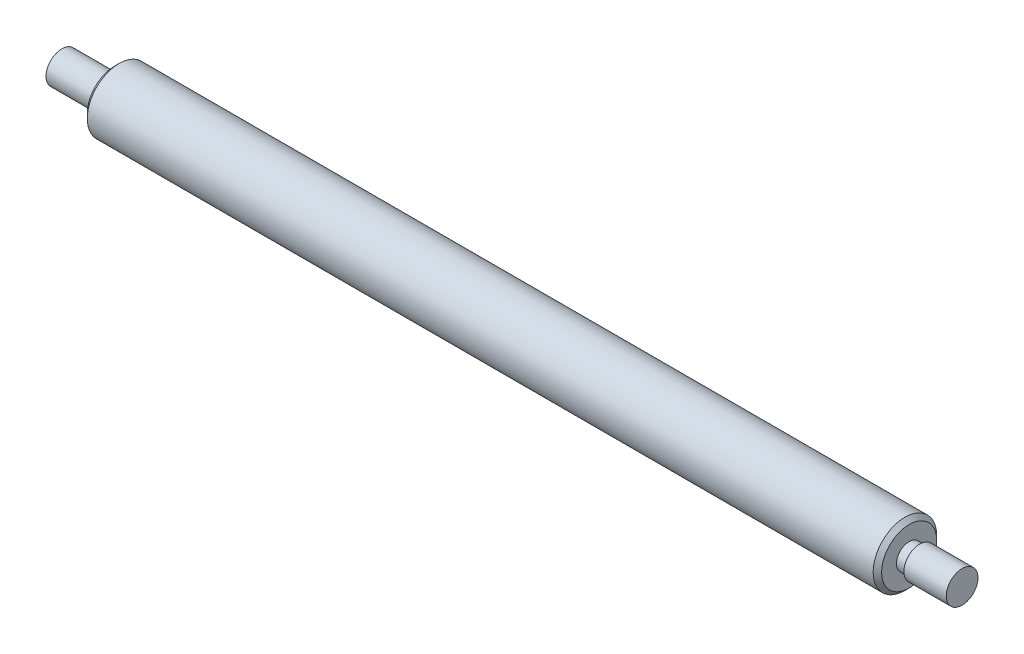
ISO-10303-21;
HEADER;
FILE_DESCRIPTION(('STEP AP214'),'2;1');
FILE_NAME('part.step','',(''),(''),'','','');
FILE_SCHEMA(('AUTOMOTIVE_DESIGN { 1 0 10303 214 1 1 1 1 }'));
ENDSEC;
DATA;
#1=APPLICATION_CONTEXT('core data for automotive mechanical design processes');
#2=APPLICATION_PROTOCOL_DEFINITION('international standard','automotive_design',2000,#1);
#3=PRODUCT_CONTEXT('',#1,'mechanical');
#4=PRODUCT('Part','Part','',(#3));
#5=PRODUCT_RELATED_PRODUCT_CATEGORY('part','',(#4));
#6=PRODUCT_DEFINITION_FORMATION('','',#4);
#7=PRODUCT_DEFINITION_CONTEXT('part definition',#1,'design');
#8=PRODUCT_DEFINITION('design','',#6,#7);
#9=PRODUCT_DEFINITION_SHAPE('','',#8);
#10=(LENGTH_UNIT() NAMED_UNIT(*) SI_UNIT(.MILLI.,.METRE.));
#11=(NAMED_UNIT(*) PLANE_ANGLE_UNIT() SI_UNIT($,.RADIAN.));
#12=(NAMED_UNIT(*) SI_UNIT($,.STERADIAN.) SOLID_ANGLE_UNIT());
#13=UNCERTAINTY_MEASURE_WITH_UNIT(LENGTH_MEASURE(1.E-05),#10,'distance_accuracy_value','');
#14=(GEOMETRIC_REPRESENTATION_CONTEXT(3) GLOBAL_UNCERTAINTY_ASSIGNED_CONTEXT((#13)) GLOBAL_UNIT_ASSIGNED_CONTEXT((#10,
#11,#12)) REPRESENTATION_CONTEXT('',''));
#15=CARTESIAN_POINT('',(0.,0.,0.));
#16=DIRECTION('',(0.,0.,1.));
#17=DIRECTION('',(1.,0.,0.));
#18=AXIS2_PLACEMENT_3D('',#15,#16,#17);
#19=CARTESIAN_POINT('',(0.,0.,0.));
#20=DIRECTION('',(1.,0.,0.));
#21=DIRECTION('',(0.,0.,-1.));
#22=AXIS2_PLACEMENT_3D('',#19,#20,#21);
#23=PLANE('',#22);
#24=CARTESIAN_POINT('',(0.,0.,0.));
#25=DIRECTION('',(1.,0.,0.));
#26=DIRECTION('',(0.,0.,-1.));
#27=AXIS2_PLACEMENT_3D('',#24,#25,#26);
#28=CIRCLE('',#27,2.);
#29=CARTESIAN_POINT('',(0.,0.,-2.));
#30=VERTEX_POINT('',#29);
#31=EDGE_CURVE('E50',#30,#30,#28,.T.);
#32=ORIENTED_EDGE('',*,*,#31,.T.);
#33=EDGE_LOOP('',(#32));
#34=FACE_BOUND('',#33,.T.);
#35=CARTESIAN_POINT('',(0.,0.,0.));
#36=DIRECTION('',(1.,0.,0.));
#37=DIRECTION('',(0.,0.,-1.));
#38=AXIS2_PLACEMENT_3D('',#35,#36,#37);
#39=CIRCLE('',#38,2.59999999999998);
#40=CARTESIAN_POINT('',(0.,0.,-2.59999999999998));
#41=VERTEX_POINT('',#40);
#42=EDGE_CURVE('E58',#41,#41,#39,.F.);
#43=ORIENTED_EDGE('',*,*,#42,.T.);
#44=EDGE_LOOP('',(#43));
#45=FACE_BOUND('',#44,.T.);
#46=ADVANCED_FACE('F35',(#34,#45),#23,.F.);
#47=CARTESIAN_POINT('',(0.,0.,0.));
#48=DIRECTION('',(-1.,0.,0.));
#49=DIRECTION('',(0.,0.,1.));
#50=AXIS2_PLACEMENT_3D('',#47,#48,#49);
#51=CYLINDRICAL_SURFACE('',#50,3.);
#52=CARTESIAN_POINT('',(74.6,0.,0.));
#53=DIRECTION('',(-1.,0.,0.));
#54=DIRECTION('',(0.,0.,1.));
#55=AXIS2_PLACEMENT_3D('',#52,#53,#54);
#56=CIRCLE('',#55,3.);
#57=CARTESIAN_POINT('',(74.6,0.,3.));
#58=VERTEX_POINT('',#57);
#59=EDGE_CURVE('E42',#58,#58,#56,.T.);
#60=ORIENTED_EDGE('',*,*,#59,.T.);
#61=EDGE_LOOP('',(#60));
#62=FACE_BOUND('',#61,.T.);
#63=CARTESIAN_POINT('',(0.400000000000018,0.,0.));
#64=DIRECTION('',(1.,0.,0.));
#65=DIRECTION('',(0.,0.,-1.));
#66=AXIS2_PLACEMENT_3D('',#63,#64,#65);
#67=CIRCLE('',#66,3.);
#68=CARTESIAN_POINT('',(0.400000000000018,0.,-3.));
#69=VERTEX_POINT('',#68);
#70=EDGE_CURVE('E55',#69,#69,#67,.T.);
#71=ORIENTED_EDGE('',*,*,#70,.T.);
#72=EDGE_LOOP('',(#71));
#73=FACE_BOUND('',#72,.T.);
#74=ADVANCED_FACE('F94',(#62,#73),#51,.T.);
#75=CARTESIAN_POINT('',(75.,3.,0.));
#76=DIRECTION('',(-1.,0.,0.));
#77=DIRECTION('',(0.,0.,1.));
#78=AXIS2_PLACEMENT_3D('',#75,#76,#77);
#79=PLANE('',#78);
#80=CARTESIAN_POINT('',(75.,0.,0.));
#81=DIRECTION('',(-1.,0.,0.));
#82=DIRECTION('',(0.,0.,1.));
#83=AXIS2_PLACEMENT_3D('',#80,#81,#82);
#84=CIRCLE('',#83,2.59999999999997);
#85=CARTESIAN_POINT('',(75.,0.,2.59999999999997));
#86=VERTEX_POINT('',#85);
#87=EDGE_CURVE('E10',#86,#86,#84,.F.);
#88=ORIENTED_EDGE('',*,*,#87,.T.);
#89=EDGE_LOOP('',(#88));
#90=FACE_BOUND('',#89,.T.);
#91=CARTESIAN_POINT('',(75.,0.,0.));
#92=DIRECTION('',(1.,0.,0.));
#93=DIRECTION('',(0.,1.,0.));
#94=AXIS2_PLACEMENT_3D('',#91,#92,#93);
#95=CIRCLE('',#94,1.2);
#96=CARTESIAN_POINT('',(75.,1.20000000000001,0.));
#97=VERTEX_POINT('',#96);
#98=EDGE_CURVE('E70',#97,#97,#95,.T.);
#99=ORIENTED_EDGE('',*,*,#98,.F.);
#100=EDGE_LOOP('',(#99));
#101=FACE_BOUND('',#100,.T.);
#102=ADVANCED_FACE('F100',(#90,#101),#79,.F.);
#103=CARTESIAN_POINT('',(0.,0.,0.));
#104=DIRECTION('',(1.,0.,0.));
#105=DIRECTION('',(0.,0.,-1.));
#106=AXIS2_PLACEMENT_3D('',#103,#104,#105);
#107=CONICAL_SURFACE('',#106,2.59999999999998,0.785398163397445);
#108=ORIENTED_EDGE('',*,*,#70,.F.);
#109=EDGE_LOOP('',(#108));
#110=FACE_BOUND('',#109,.T.);
#111=ORIENTED_EDGE('',*,*,#42,.F.);
#112=EDGE_LOOP('',(#111));
#113=FACE_BOUND('',#112,.T.);
#114=ADVANCED_FACE('F105',(#110,#113),#107,.T.);
#115=CARTESIAN_POINT('',(80.,0.,0.));
#116=DIRECTION('',(1.,0.,0.));
#117=DIRECTION('',(0.,1.,0.));
#118=AXIS2_PLACEMENT_3D('',#115,#116,#117);
#119=PLANE('',#118);
#120=CARTESIAN_POINT('',(80.,0.,0.));
#121=DIRECTION('',(1.,0.,0.));
#122=DIRECTION('',(0.,1.,0.));
#123=AXIS2_PLACEMENT_3D('',#120,#121,#122);
#124=CIRCLE('',#123,1.49999999999999);
#125=CARTESIAN_POINT('',(80.,1.5,0.));
#126=VERTEX_POINT('',#125);
#127=EDGE_CURVE('E61',#126,#126,#124,.T.);
#128=ORIENTED_EDGE('',*,*,#127,.T.);
#129=EDGE_LOOP('',(#128));
#130=FACE_BOUND('',#129,.T.);
#131=ADVANCED_FACE('F107',(#130),#119,.T.);
#132=CARTESIAN_POINT('',(80.,0.,0.));
#133=DIRECTION('',(1.,0.,0.));
#134=DIRECTION('',(0.,1.,0.));
#135=AXIS2_PLACEMENT_3D('',#132,#133,#134);
#136=CYLINDRICAL_SURFACE('',#135,1.49999999999999);
#137=CARTESIAN_POINT('',(76.,0.,0.));
#138=DIRECTION('',(1.,0.,0.));
#139=DIRECTION('',(0.,1.,0.));
#140=AXIS2_PLACEMENT_3D('',#137,#138,#139);
#141=CIRCLE('',#140,1.49999999999999);
#142=CARTESIAN_POINT('',(76.,1.5,0.));
#143=VERTEX_POINT('',#142);
#144=EDGE_CURVE('E64',#143,#143,#141,.T.);
#145=ORIENTED_EDGE('',*,*,#144,.T.);
#146=EDGE_LOOP('',(#145));
#147=FACE_BOUND('',#146,.T.);
#148=ORIENTED_EDGE('',*,*,#127,.F.);
#149=EDGE_LOOP('',(#148));
#150=FACE_BOUND('',#149,.T.);
#151=ADVANCED_FACE('F171',(#147,#150),#136,.T.);
#152=CARTESIAN_POINT('',(76.,1.5,0.));
#153=DIRECTION('',(-1.,0.,0.));
#154=DIRECTION('',(0.,-1.,0.));
#155=AXIS2_PLACEMENT_3D('',#152,#153,#154);
#156=PLANE('',#155);
#157=CARTESIAN_POINT('',(76.,0.,0.));
#158=DIRECTION('',(1.,0.,0.));
#159=DIRECTION('',(0.,1.,0.));
#160=AXIS2_PLACEMENT_3D('',#157,#158,#159);
#161=CIRCLE('',#160,1.2);
#162=CARTESIAN_POINT('',(76.,1.20000000000001,0.));
#163=VERTEX_POINT('',#162);
#164=EDGE_CURVE('E67',#163,#163,#161,.T.);
#165=ORIENTED_EDGE('',*,*,#164,.T.);
#166=EDGE_LOOP('',(#165));
#167=FACE_BOUND('',#166,.T.);
#168=ORIENTED_EDGE('',*,*,#144,.F.);
#169=EDGE_LOOP('',(#168));
#170=FACE_BOUND('',#169,.T.);
#171=ADVANCED_FACE('F90',(#167,#170),#156,.T.);
#172=CARTESIAN_POINT('',(80.,0.,0.));
#173=DIRECTION('',(1.,0.,0.));
#174=DIRECTION('',(0.,1.,0.));
#175=AXIS2_PLACEMENT_3D('',#172,#173,#174);
#176=CYLINDRICAL_SURFACE('',#175,1.2);
#177=ORIENTED_EDGE('',*,*,#98,.T.);
#178=EDGE_LOOP('',(#177));
#179=FACE_BOUND('',#178,.T.);
#180=ORIENTED_EDGE('',*,*,#164,.F.);
#181=EDGE_LOOP('',(#180));
#182=FACE_BOUND('',#181,.T.);
#183=ADVANCED_FACE('F81',(#179,#182),#176,.T.);
#184=CARTESIAN_POINT('',(-5.,0.,0.));
#185=DIRECTION('',(-1.,0.,0.));
#186=DIRECTION('',(0.,-1.,0.));
#187=AXIS2_PLACEMENT_3D('',#184,#185,#186);
#188=PLANE('',#187);
#189=CARTESIAN_POINT('',(-5.,0.,0.));
#190=DIRECTION('',(1.,0.,0.));
#191=DIRECTION('',(0.,1.,0.));
#192=AXIS2_PLACEMENT_3D('',#189,#190,#191);
#193=CIRCLE('',#192,1.5);
#194=CARTESIAN_POINT('',(-5.,1.5,0.));
#195=VERTEX_POINT('',#194);
#196=EDGE_CURVE('E73',#195,#195,#193,.T.);
#197=ORIENTED_EDGE('',*,*,#196,.F.);
#198=EDGE_LOOP('',(#197));
#199=FACE_BOUND('',#198,.T.);
#200=ADVANCED_FACE('F79',(#199),#188,.T.);
#201=CARTESIAN_POINT('',(80.,0.,0.));
#202=DIRECTION('',(1.,0.,0.));
#203=DIRECTION('',(0.,1.,0.));
#204=AXIS2_PLACEMENT_3D('',#201,#202,#203);
#205=CYLINDRICAL_SURFACE('',#204,1.5);
#206=CARTESIAN_POINT('',(-0.5,0.,0.));
#207=DIRECTION('',(1.,0.,0.));
#208=DIRECTION('',(0.,0.,-1.));
#209=AXIS2_PLACEMENT_3D('',#206,#207,#208);
#210=CIRCLE('',#209,1.5);
#211=CARTESIAN_POINT('',(-0.5,0.,-1.5));
#212=VERTEX_POINT('',#211);
#213=EDGE_CURVE('E46',#212,#212,#210,.F.);
#214=ORIENTED_EDGE('',*,*,#213,.T.);
#215=EDGE_LOOP('',(#214));
#216=FACE_BOUND('',#215,.T.);
#217=ORIENTED_EDGE('',*,*,#196,.T.);
#218=EDGE_LOOP('',(#217));
#219=FACE_BOUND('',#218,.T.);
#220=ADVANCED_FACE('F77',(#216,#219),#205,.T.);
#221=CARTESIAN_POINT('',(-0.5,0.,0.));
#222=DIRECTION('',(1.,0.,0.));
#223=DIRECTION('',(0.,0.,-1.));
#224=AXIS2_PLACEMENT_3D('',#221,#222,#223);
#225=TOROIDAL_SURFACE('',#224,2.,0.5);
#226=ORIENTED_EDGE('',*,*,#213,.F.);
#227=EDGE_LOOP('',(#226));
#228=FACE_BOUND('',#227,.T.);
#229=ORIENTED_EDGE('',*,*,#31,.F.);
#230=EDGE_LOOP('',(#229));
#231=FACE_BOUND('',#230,.T.);
#232=ADVANCED_FACE('F87',(#228,#231),#225,.F.);
#233=CARTESIAN_POINT('',(74.6,0.,0.));
#234=DIRECTION('',(-1.,0.,0.));
#235=DIRECTION('',(0.,0.,1.));
#236=AXIS2_PLACEMENT_3D('',#233,#234,#235);
#237=CONICAL_SURFACE('',#236,3.,0.785398163397437);
#238=ORIENTED_EDGE('',*,*,#87,.F.);
#239=EDGE_LOOP('',(#238));
#240=FACE_BOUND('',#239,.T.);
#241=ORIENTED_EDGE('',*,*,#59,.F.);
#242=EDGE_LOOP('',(#241));
#243=FACE_BOUND('',#242,.T.);
#244=ADVANCED_FACE('F37',(#240,#243),#237,.T.);
#245=CLOSED_SHELL('',(#46,#74,#102,#114,#131,#151,#171,#183,#200,#220,#232,#244));
#246=MANIFOLD_SOLID_BREP('B2',#245);
#247=ADVANCED_BREP_SHAPE_REPRESENTATION('',(#18,#246),#14);
#248=SHAPE_DEFINITION_REPRESENTATION(#9,#247);
ENDSEC;
END-ISO-10303-21;
